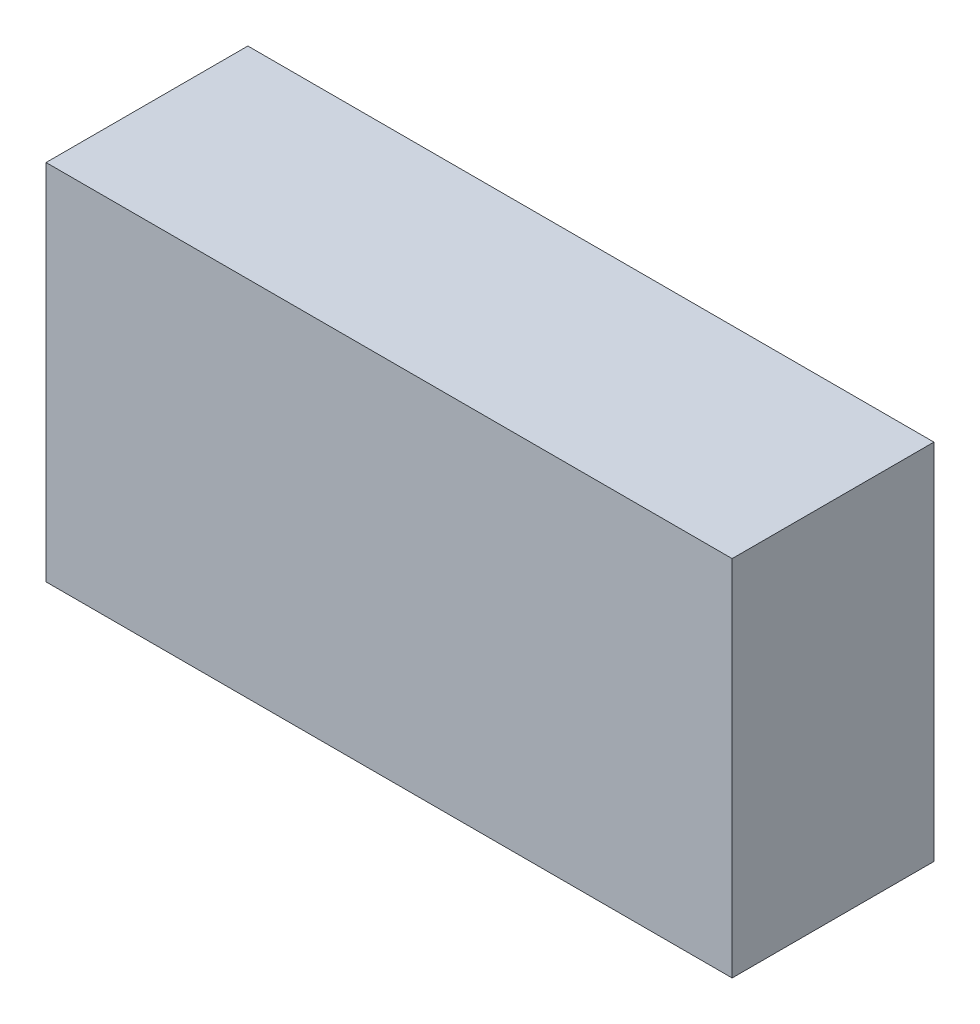
ISO-10303-21;
HEADER;
FILE_DESCRIPTION(('STEP AP214'),'2;1');
FILE_NAME('part.step','',(''),(''),'','','');
FILE_SCHEMA(('AUTOMOTIVE_DESIGN { 1 0 10303 214 1 1 1 1 }'));
ENDSEC;
DATA;
#1=APPLICATION_CONTEXT('core data for automotive mechanical design processes');
#2=APPLICATION_PROTOCOL_DEFINITION('international standard','automotive_design',2000,#1);
#3=PRODUCT_CONTEXT('',#1,'mechanical');
#4=PRODUCT('Part','Part','',(#3));
#5=PRODUCT_RELATED_PRODUCT_CATEGORY('part','',(#4));
#6=PRODUCT_DEFINITION_FORMATION('','',#4);
#7=PRODUCT_DEFINITION_CONTEXT('part definition',#1,'design');
#8=PRODUCT_DEFINITION('design','',#6,#7);
#9=PRODUCT_DEFINITION_SHAPE('','',#8);
#10=(LENGTH_UNIT() NAMED_UNIT(*) SI_UNIT(.MILLI.,.METRE.));
#11=(NAMED_UNIT(*) PLANE_ANGLE_UNIT() SI_UNIT($,.RADIAN.));
#12=(NAMED_UNIT(*) SI_UNIT($,.STERADIAN.) SOLID_ANGLE_UNIT());
#13=UNCERTAINTY_MEASURE_WITH_UNIT(LENGTH_MEASURE(1.E-05),#10,'distance_accuracy_value','');
#14=(GEOMETRIC_REPRESENTATION_CONTEXT(3) GLOBAL_UNCERTAINTY_ASSIGNED_CONTEXT((#13)) GLOBAL_UNIT_ASSIGNED_CONTEXT((#10,
#11,#12)) REPRESENTATION_CONTEXT('',''));
#15=CARTESIAN_POINT('',(0.,0.,0.));
#16=DIRECTION('',(0.,0.,1.));
#17=DIRECTION('',(1.,0.,0.));
#18=AXIS2_PLACEMENT_3D('',#15,#16,#17);
#19=CARTESIAN_POINT('',(0.,0.,0.5));
#20=DIRECTION('',(0.,0.,1.));
#21=DIRECTION('',(1.,0.,0.));
#22=AXIS2_PLACEMENT_3D('',#19,#20,#21);
#23=PLANE('',#22);
#24=DIRECTION('',(1.,0.,0.));
#25=VECTOR('',#24,1.);
#26=CARTESIAN_POINT('',(-0.85,-0.45,0.5));
#27=LINE('',#26,#25);
#28=CARTESIAN_POINT('',(-0.85,-0.45,0.5));
#29=VERTEX_POINT('',#28);
#30=CARTESIAN_POINT('',(0.85,-0.45,0.5));
#31=VERTEX_POINT('',#30);
#32=EDGE_CURVE('E88',#29,#31,#27,.T.);
#33=ORIENTED_EDGE('',*,*,#32,.T.);
#34=DIRECTION('',(0.,1.,0.));
#35=VECTOR('',#34,1.);
#36=CARTESIAN_POINT('',(0.85,-0.45,0.5));
#37=LINE('',#36,#35);
#38=CARTESIAN_POINT('',(0.85,0.45,0.5));
#39=VERTEX_POINT('',#38);
#40=EDGE_CURVE('E87',#31,#39,#37,.T.);
#41=ORIENTED_EDGE('',*,*,#40,.T.);
#42=DIRECTION('',(-1.,0.,0.));
#43=VECTOR('',#42,1.);
#44=CARTESIAN_POINT('',(0.85,0.45,0.5));
#45=LINE('',#44,#43);
#46=CARTESIAN_POINT('',(-0.85,0.45,0.5));
#47=VERTEX_POINT('',#46);
#48=EDGE_CURVE('E80',#39,#47,#45,.T.);
#49=ORIENTED_EDGE('',*,*,#48,.T.);
#50=DIRECTION('',(0.,-1.,0.));
#51=VECTOR('',#50,1.);
#52=CARTESIAN_POINT('',(-0.85,0.45,0.5));
#53=LINE('',#52,#51);
#54=EDGE_CURVE('E11',#47,#29,#53,.T.);
#55=ORIENTED_EDGE('',*,*,#54,.T.);
#56=EDGE_LOOP('',(#33,#41,#49,#55));
#57=FACE_BOUND('',#56,.T.);
#58=ADVANCED_FACE('F16',(#57),#23,.T.);
#59=CARTESIAN_POINT('',(0.,0.,0.));
#60=DIRECTION('',(0.,0.,1.));
#61=DIRECTION('',(1.,0.,0.));
#62=AXIS2_PLACEMENT_3D('',#59,#60,#61);
#63=PLANE('',#62);
#64=DIRECTION('',(1.,0.,0.));
#65=VECTOR('',#64,1.);
#66=CARTESIAN_POINT('',(-0.85,-0.45,0.));
#67=LINE('',#66,#65);
#68=CARTESIAN_POINT('',(-0.85,-0.45,0.));
#69=VERTEX_POINT('',#68);
#70=CARTESIAN_POINT('',(0.85,-0.45,0.));
#71=VERTEX_POINT('',#70);
#72=EDGE_CURVE('E103',#69,#71,#67,.T.);
#73=ORIENTED_EDGE('',*,*,#72,.F.);
#74=DIRECTION('',(0.,-1.,0.));
#75=VECTOR('',#74,1.);
#76=CARTESIAN_POINT('',(-0.85,0.45,0.));
#77=LINE('',#76,#75);
#78=CARTESIAN_POINT('',(-0.85,0.45,0.));
#79=VERTEX_POINT('',#78);
#80=EDGE_CURVE('E27',#79,#69,#77,.T.);
#81=ORIENTED_EDGE('',*,*,#80,.F.);
#82=DIRECTION('',(-1.,0.,0.));
#83=VECTOR('',#82,1.);
#84=CARTESIAN_POINT('',(0.85,0.45,0.));
#85=LINE('',#84,#83);
#86=CARTESIAN_POINT('',(0.85,0.45,0.));
#87=VERTEX_POINT('',#86);
#88=EDGE_CURVE('E74',#87,#79,#85,.T.);
#89=ORIENTED_EDGE('',*,*,#88,.F.);
#90=DIRECTION('',(0.,1.,0.));
#91=VECTOR('',#90,1.);
#92=CARTESIAN_POINT('',(0.85,-0.45,0.));
#93=LINE('',#92,#91);
#94=EDGE_CURVE('E54',#71,#87,#93,.T.);
#95=ORIENTED_EDGE('',*,*,#94,.F.);
#96=EDGE_LOOP('',(#73,#81,#89,#95));
#97=FACE_BOUND('',#96,.T.);
#98=ADVANCED_FACE('F18',(#97),#63,.F.);
#99=CARTESIAN_POINT('',(-0.85,0.45,0.));
#100=DIRECTION('',(1.,0.,0.));
#101=DIRECTION('',(0.,1.,0.));
#102=AXIS2_PLACEMENT_3D('',#99,#100,#101);
#103=PLANE('',#102);
#104=DIRECTION('',(0.,0.,1.));
#105=VECTOR('',#104,1.);
#106=CARTESIAN_POINT('',(-0.85,0.45,0.));
#107=LINE('',#106,#105);
#108=EDGE_CURVE('E20',#79,#47,#107,.T.);
#109=ORIENTED_EDGE('',*,*,#108,.F.);
#110=ORIENTED_EDGE('',*,*,#80,.T.);
#111=DIRECTION('',(0.,0.,1.));
#112=VECTOR('',#111,1.);
#113=CARTESIAN_POINT('',(-0.85,-0.45,0.));
#114=LINE('',#113,#112);
#115=EDGE_CURVE('E107',#69,#29,#114,.T.);
#116=ORIENTED_EDGE('',*,*,#115,.T.);
#117=ORIENTED_EDGE('',*,*,#54,.F.);
#118=EDGE_LOOP('',(#109,#110,#116,#117));
#119=FACE_BOUND('',#118,.T.);
#120=ADVANCED_FACE('F115',(#119),#103,.F.);
#121=CARTESIAN_POINT('',(0.85,0.45,0.));
#122=DIRECTION('',(0.,-1.,0.));
#123=DIRECTION('',(0.,0.,-1.));
#124=AXIS2_PLACEMENT_3D('',#121,#122,#123);
#125=PLANE('',#124);
#126=DIRECTION('',(0.,0.,1.));
#127=VECTOR('',#126,1.);
#128=CARTESIAN_POINT('',(0.85,0.45,0.));
#129=LINE('',#128,#127);
#130=EDGE_CURVE('E84',#87,#39,#129,.T.);
#131=ORIENTED_EDGE('',*,*,#130,.F.);
#132=ORIENTED_EDGE('',*,*,#88,.T.);
#133=ORIENTED_EDGE('',*,*,#108,.T.);
#134=ORIENTED_EDGE('',*,*,#48,.F.);
#135=EDGE_LOOP('',(#131,#132,#133,#134));
#136=FACE_BOUND('',#135,.T.);
#137=ADVANCED_FACE('F82',(#136),#125,.F.);
#138=CARTESIAN_POINT('',(0.85,-0.45,0.));
#139=DIRECTION('',(-1.,0.,0.));
#140=DIRECTION('',(0.,0.,1.));
#141=AXIS2_PLACEMENT_3D('',#138,#139,#140);
#142=PLANE('',#141);
#143=DIRECTION('',(0.,0.,1.));
#144=VECTOR('',#143,1.);
#145=CARTESIAN_POINT('',(0.85,-0.45,0.));
#146=LINE('',#145,#144);
#147=EDGE_CURVE('E102',#71,#31,#146,.T.);
#148=ORIENTED_EDGE('',*,*,#147,.F.);
#149=ORIENTED_EDGE('',*,*,#94,.T.);
#150=ORIENTED_EDGE('',*,*,#130,.T.);
#151=ORIENTED_EDGE('',*,*,#40,.F.);
#152=EDGE_LOOP('',(#148,#149,#150,#151));
#153=FACE_BOUND('',#152,.T.);
#154=ADVANCED_FACE('F93',(#153),#142,.F.);
#155=CARTESIAN_POINT('',(-0.85,-0.45,0.));
#156=DIRECTION('',(0.,1.,0.));
#157=DIRECTION('',(1.,0.,0.));
#158=AXIS2_PLACEMENT_3D('',#155,#156,#157);
#159=PLANE('',#158);
#160=ORIENTED_EDGE('',*,*,#115,.F.);
#161=ORIENTED_EDGE('',*,*,#72,.T.);
#162=ORIENTED_EDGE('',*,*,#147,.T.);
#163=ORIENTED_EDGE('',*,*,#32,.F.);
#164=EDGE_LOOP('',(#160,#161,#162,#163));
#165=FACE_BOUND('',#164,.T.);
#166=ADVANCED_FACE('F118',(#165),#159,.F.);
#167=CLOSED_SHELL('',(#58,#98,#120,#137,#154,#166));
#168=MANIFOLD_SOLID_BREP('B1',#167);
#169=ADVANCED_BREP_SHAPE_REPRESENTATION('',(#18,#168),#14);
#170=SHAPE_DEFINITION_REPRESENTATION(#9,#169);
ENDSEC;
END-ISO-10303-21;
